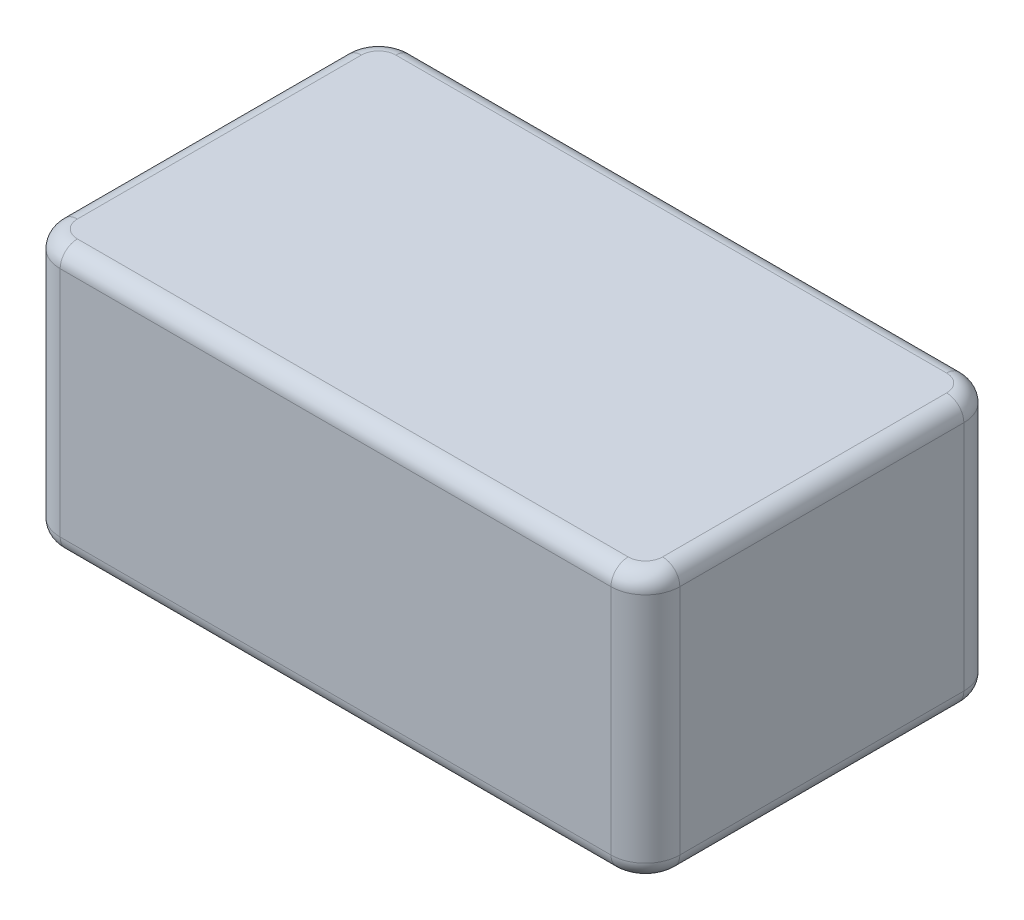
ISO-10303-21;
HEADER;
FILE_DESCRIPTION(('STEP AP214'),'2;1');
FILE_NAME('part.step','',(''),(''),'','','');
FILE_SCHEMA(('AUTOMOTIVE_DESIGN { 1 0 10303 214 1 1 1 1 }'));
ENDSEC;
DATA;
#1=APPLICATION_CONTEXT('core data for automotive mechanical design processes');
#2=APPLICATION_PROTOCOL_DEFINITION('international standard','automotive_design',2000,#1);
#3=PRODUCT_CONTEXT('',#1,'mechanical');
#4=PRODUCT('Part','Part','',(#3));
#5=PRODUCT_RELATED_PRODUCT_CATEGORY('part','',(#4));
#6=PRODUCT_DEFINITION_FORMATION('','',#4);
#7=PRODUCT_DEFINITION_CONTEXT('part definition',#1,'design');
#8=PRODUCT_DEFINITION('design','',#6,#7);
#9=PRODUCT_DEFINITION_SHAPE('','',#8);
#10=(LENGTH_UNIT() NAMED_UNIT(*) SI_UNIT(.MILLI.,.METRE.));
#11=(NAMED_UNIT(*) PLANE_ANGLE_UNIT() SI_UNIT($,.RADIAN.));
#12=(NAMED_UNIT(*) SI_UNIT($,.STERADIAN.) SOLID_ANGLE_UNIT());
#13=UNCERTAINTY_MEASURE_WITH_UNIT(LENGTH_MEASURE(1.E-05),#10,'distance_accuracy_value','');
#14=(GEOMETRIC_REPRESENTATION_CONTEXT(3) GLOBAL_UNCERTAINTY_ASSIGNED_CONTEXT((#13)) GLOBAL_UNIT_ASSIGNED_CONTEXT((#10,
#11,#12)) REPRESENTATION_CONTEXT('',''));
#15=CARTESIAN_POINT('',(0.,0.,0.));
#16=DIRECTION('',(0.,0.,1.));
#17=DIRECTION('',(1.,0.,0.));
#18=AXIS2_PLACEMENT_3D('',#15,#16,#17);
#19=CARTESIAN_POINT('',(0.,15.5,0.));
#20=DIRECTION('',(1.,0.,0.));
#21=DIRECTION('',(0.,0.,-1.));
#22=AXIS2_PLACEMENT_3D('',#19,#20,#21);
#23=PLANE('',#22);
#24=DIRECTION('',(0.,-1.,0.));
#25=VECTOR('',#24,1.);
#26=CARTESIAN_POINT('',(0.,15.5,-18.5));
#27=LINE('',#26,#25);
#28=CARTESIAN_POINT('',(0.,14.5,-18.5));
#29=VERTEX_POINT('',#28);
#30=CARTESIAN_POINT('',(0.,1.,-18.5));
#31=VERTEX_POINT('',#30);
#32=EDGE_CURVE('E306',#29,#31,#27,.T.);
#33=ORIENTED_EDGE('',*,*,#32,.T.);
#34=DIRECTION('',(0.,0.,1.));
#35=VECTOR('',#34,1.);
#36=CARTESIAN_POINT('',(0.,1.,-2.));
#37=LINE('',#36,#35);
#38=CARTESIAN_POINT('',(0.,1.,-2.));
#39=VERTEX_POINT('',#38);
#40=EDGE_CURVE('E200',#31,#39,#37,.T.);
#41=ORIENTED_EDGE('',*,*,#40,.T.);
#42=DIRECTION('',(0.,-1.,0.));
#43=VECTOR('',#42,1.);
#44=CARTESIAN_POINT('',(0.,15.5,-2.));
#45=LINE('',#44,#43);
#46=CARTESIAN_POINT('',(0.,14.5,-2.));
#47=VERTEX_POINT('',#46);
#48=EDGE_CURVE('E251',#39,#47,#45,.F.);
#49=ORIENTED_EDGE('',*,*,#48,.T.);
#50=DIRECTION('',(0.,0.,1.));
#51=VECTOR('',#50,1.);
#52=CARTESIAN_POINT('',(0.,14.5,0.));
#53=LINE('',#52,#51);
#54=EDGE_CURVE('E198',#47,#29,#53,.F.);
#55=ORIENTED_EDGE('',*,*,#54,.T.);
#56=EDGE_LOOP('',(#33,#41,#49,#55));
#57=FACE_BOUND('',#56,.T.);
#58=ADVANCED_FACE('F35',(#57),#23,.F.);
#59=CARTESIAN_POINT('',(0.,15.5,0.));
#60=DIRECTION('',(0.,0.,-1.));
#61=DIRECTION('',(-1.,0.,0.));
#62=AXIS2_PLACEMENT_3D('',#59,#60,#61);
#63=PLANE('',#62);
#64=DIRECTION('',(0.,-1.,0.));
#65=VECTOR('',#64,1.);
#66=CARTESIAN_POINT('',(2.,15.5,0.));
#67=LINE('',#66,#65);
#68=CARTESIAN_POINT('',(2.,14.5,0.));
#69=VERTEX_POINT('',#68);
#70=CARTESIAN_POINT('',(2.,1.,0.));
#71=VERTEX_POINT('',#70);
#72=EDGE_CURVE('E177',#69,#71,#67,.T.);
#73=ORIENTED_EDGE('',*,*,#72,.T.);
#74=DIRECTION('',(1.,0.,0.));
#75=VECTOR('',#74,1.);
#76=CARTESIAN_POINT('',(34.,1.,0.));
#77=LINE('',#76,#75);
#78=CARTESIAN_POINT('',(34.,1.,0.));
#79=VERTEX_POINT('',#78);
#80=EDGE_CURVE('E11',#71,#79,#77,.T.);
#81=ORIENTED_EDGE('',*,*,#80,.T.);
#82=DIRECTION('',(0.,-1.,0.));
#83=VECTOR('',#82,1.);
#84=CARTESIAN_POINT('',(34.,15.5,0.));
#85=LINE('',#84,#83);
#86=CARTESIAN_POINT('',(34.,14.5,0.));
#87=VERTEX_POINT('',#86);
#88=EDGE_CURVE('E174',#79,#87,#85,.F.);
#89=ORIENTED_EDGE('',*,*,#88,.T.);
#90=DIRECTION('',(1.,0.,0.));
#91=VECTOR('',#90,1.);
#92=CARTESIAN_POINT('',(0.,14.5,0.));
#93=LINE('',#92,#91);
#94=EDGE_CURVE('E44',#87,#69,#93,.F.);
#95=ORIENTED_EDGE('',*,*,#94,.T.);
#96=EDGE_LOOP('',(#73,#81,#89,#95));
#97=FACE_BOUND('',#96,.T.);
#98=ADVANCED_FACE('F352',(#97),#63,.F.);
#99=CARTESIAN_POINT('',(36.,15.5,0.));
#100=DIRECTION('',(-1.,0.,0.));
#101=DIRECTION('',(0.,0.,1.));
#102=AXIS2_PLACEMENT_3D('',#99,#100,#101);
#103=PLANE('',#102);
#104=DIRECTION('',(0.,-1.,0.));
#105=VECTOR('',#104,1.);
#106=CARTESIAN_POINT('',(36.,15.5,-2.));
#107=LINE('',#106,#105);
#108=CARTESIAN_POINT('',(36.,14.5,-2.));
#109=VERTEX_POINT('',#108);
#110=CARTESIAN_POINT('',(36.,1.,-2.));
#111=VERTEX_POINT('',#110);
#112=EDGE_CURVE('E297',#109,#111,#107,.T.);
#113=ORIENTED_EDGE('',*,*,#112,.T.);
#114=DIRECTION('',(0.,0.,-1.));
#115=VECTOR('',#114,1.);
#116=CARTESIAN_POINT('',(36.,1.,-18.5));
#117=LINE('',#116,#115);
#118=CARTESIAN_POINT('',(36.,1.,-18.5));
#119=VERTEX_POINT('',#118);
#120=EDGE_CURVE('E216',#111,#119,#117,.T.);
#121=ORIENTED_EDGE('',*,*,#120,.T.);
#122=DIRECTION('',(0.,-1.,0.));
#123=VECTOR('',#122,1.);
#124=CARTESIAN_POINT('',(36.,15.5,-18.5));
#125=LINE('',#124,#123);
#126=CARTESIAN_POINT('',(36.,14.5,-18.5));
#127=VERTEX_POINT('',#126);
#128=EDGE_CURVE('E288',#119,#127,#125,.F.);
#129=ORIENTED_EDGE('',*,*,#128,.T.);
#130=DIRECTION('',(0.,0.,-1.));
#131=VECTOR('',#130,1.);
#132=CARTESIAN_POINT('',(36.,14.5,0.));
#133=LINE('',#132,#131);
#134=EDGE_CURVE('E214',#127,#109,#133,.F.);
#135=ORIENTED_EDGE('',*,*,#134,.T.);
#136=EDGE_LOOP('',(#113,#121,#129,#135));
#137=FACE_BOUND('',#136,.T.);
#138=ADVANCED_FACE('F294',(#137),#103,.F.);
#139=CARTESIAN_POINT('',(0.,15.5,-20.5));
#140=DIRECTION('',(0.,0.,1.));
#141=DIRECTION('',(1.,0.,0.));
#142=AXIS2_PLACEMENT_3D('',#139,#140,#141);
#143=PLANE('',#142);
#144=DIRECTION('',(0.,-1.,0.));
#145=VECTOR('',#144,1.);
#146=CARTESIAN_POINT('',(34.,15.5,-20.5));
#147=LINE('',#146,#145);
#148=CARTESIAN_POINT('',(34.,14.5,-20.5));
#149=VERTEX_POINT('',#148);
#150=CARTESIAN_POINT('',(34.,1.,-20.5));
#151=VERTEX_POINT('',#150);
#152=EDGE_CURVE('E291',#149,#151,#147,.T.);
#153=ORIENTED_EDGE('',*,*,#152,.T.);
#154=DIRECTION('',(-1.,0.,0.));
#155=VECTOR('',#154,1.);
#156=CARTESIAN_POINT('',(2.,1.,-20.5));
#157=LINE('',#156,#155);
#158=CARTESIAN_POINT('',(2.,1.,-20.5));
#159=VERTEX_POINT('',#158);
#160=EDGE_CURVE('E208',#151,#159,#157,.T.);
#161=ORIENTED_EDGE('',*,*,#160,.T.);
#162=DIRECTION('',(0.,-1.,0.));
#163=VECTOR('',#162,1.);
#164=CARTESIAN_POINT('',(2.,15.5,-20.5));
#165=LINE('',#164,#163);
#166=CARTESIAN_POINT('',(2.,14.5,-20.5));
#167=VERTEX_POINT('',#166);
#168=EDGE_CURVE('E300',#159,#167,#165,.F.);
#169=ORIENTED_EDGE('',*,*,#168,.T.);
#170=DIRECTION('',(-1.,0.,0.));
#171=VECTOR('',#170,1.);
#172=CARTESIAN_POINT('',(0.,14.5,-20.5));
#173=LINE('',#172,#171);
#174=EDGE_CURVE('E206',#167,#149,#173,.F.);
#175=ORIENTED_EDGE('',*,*,#174,.T.);
#176=EDGE_LOOP('',(#153,#161,#169,#175));
#177=FACE_BOUND('',#176,.T.);
#178=ADVANCED_FACE('F550',(#177),#143,.F.);
#179=CARTESIAN_POINT('',(0.,15.5,0.));
#180=DIRECTION('',(0.,-1.,0.));
#181=DIRECTION('',(0.,0.,-1.));
#182=AXIS2_PLACEMENT_3D('',#179,#180,#181);
#183=PLANE('',#182);
#184=DIRECTION('',(0.,0.,1.));
#185=VECTOR('',#184,1.);
#186=CARTESIAN_POINT('',(1.,15.5,0.));
#187=LINE('',#186,#185);
#188=CARTESIAN_POINT('',(1.,15.5,-18.5));
#189=VERTEX_POINT('',#188);
#190=CARTESIAN_POINT('',(1.,15.5,-2.));
#191=VERTEX_POINT('',#190);
#192=EDGE_CURVE('E52',#189,#191,#187,.T.);
#193=ORIENTED_EDGE('',*,*,#192,.T.);
#194=CARTESIAN_POINT('',(2.,15.5,-2.));
#195=DIRECTION('',(0.,-1.,0.));
#196=DIRECTION('',(0.,0.,-1.));
#197=AXIS2_PLACEMENT_3D('',#194,#195,#196);
#198=CIRCLE('',#197,1.);
#199=CARTESIAN_POINT('',(2.,15.5,-1.));
#200=VERTEX_POINT('',#199);
#201=EDGE_CURVE('E233',#191,#200,#198,.F.);
#202=ORIENTED_EDGE('',*,*,#201,.T.);
#203=DIRECTION('',(1.,0.,0.));
#204=VECTOR('',#203,1.);
#205=CARTESIAN_POINT('',(0.,15.5,-1.));
#206=LINE('',#205,#204);
#207=CARTESIAN_POINT('',(34.,15.5,-1.));
#208=VERTEX_POINT('',#207);
#209=EDGE_CURVE('E221',#200,#208,#206,.T.);
#210=ORIENTED_EDGE('',*,*,#209,.T.);
#211=CARTESIAN_POINT('',(34.,15.5,-2.));
#212=DIRECTION('',(0.,-1.,0.));
#213=DIRECTION('',(0.,0.,-1.));
#214=AXIS2_PLACEMENT_3D('',#211,#212,#213);
#215=CIRCLE('',#214,1.);
#216=CARTESIAN_POINT('',(35.,15.5,-2.));
#217=VERTEX_POINT('',#216);
#218=EDGE_CURVE('E223',#208,#217,#215,.F.);
#219=ORIENTED_EDGE('',*,*,#218,.T.);
#220=DIRECTION('',(0.,0.,-1.));
#221=VECTOR('',#220,1.);
#222=CARTESIAN_POINT('',(35.,15.5,0.));
#223=LINE('',#222,#221);
#224=CARTESIAN_POINT('',(35.,15.5,-18.5));
#225=VERTEX_POINT('',#224);
#226=EDGE_CURVE('E225',#217,#225,#223,.T.);
#227=ORIENTED_EDGE('',*,*,#226,.T.);
#228=CARTESIAN_POINT('',(34.,15.5,-18.5));
#229=DIRECTION('',(0.,-1.,0.));
#230=DIRECTION('',(0.,0.,-1.));
#231=AXIS2_PLACEMENT_3D('',#228,#229,#230);
#232=CIRCLE('',#231,1.);
#233=CARTESIAN_POINT('',(34.,15.5,-19.5));
#234=VERTEX_POINT('',#233);
#235=EDGE_CURVE('E227',#225,#234,#232,.F.);
#236=ORIENTED_EDGE('',*,*,#235,.T.);
#237=DIRECTION('',(-1.,0.,0.));
#238=VECTOR('',#237,1.);
#239=CARTESIAN_POINT('',(0.,15.5,-19.5));
#240=LINE('',#239,#238);
#241=CARTESIAN_POINT('',(2.,15.5,-19.5));
#242=VERTEX_POINT('',#241);
#243=EDGE_CURVE('E229',#234,#242,#240,.T.);
#244=ORIENTED_EDGE('',*,*,#243,.T.);
#245=CARTESIAN_POINT('',(2.,15.5,-18.5));
#246=DIRECTION('',(0.,-1.,0.));
#247=DIRECTION('',(0.,0.,-1.));
#248=AXIS2_PLACEMENT_3D('',#245,#246,#247);
#249=CIRCLE('',#248,1.);
#250=EDGE_CURVE('E57',#242,#189,#249,.F.);
#251=ORIENTED_EDGE('',*,*,#250,.T.);
#252=EDGE_LOOP('',(#193,#202,#210,#219,#227,#236,#244,#251));
#253=FACE_BOUND('',#252,.T.);
#254=ADVANCED_FACE('F542',(#253),#183,.F.);
#255=CARTESIAN_POINT('',(0.,0.,0.));
#256=DIRECTION('',(0.,-1.,0.));
#257=DIRECTION('',(0.,0.,-1.));
#258=AXIS2_PLACEMENT_3D('',#255,#256,#257);
#259=PLANE('',#258);
#260=DIRECTION('',(1.,0.,0.));
#261=VECTOR('',#260,1.);
#262=CARTESIAN_POINT('',(2.,0.,-1.));
#263=LINE('',#262,#261);
#264=CARTESIAN_POINT('',(34.,0.,-1.));
#265=VERTEX_POINT('',#264);
#266=CARTESIAN_POINT('',(2.,0.,-1.));
#267=VERTEX_POINT('',#266);
#268=EDGE_CURVE('E153',#265,#267,#263,.F.);
#269=ORIENTED_EDGE('',*,*,#268,.T.);
#270=CARTESIAN_POINT('',(2.,0.,-2.));
#271=DIRECTION('',(0.,-1.,0.));
#272=DIRECTION('',(0.,0.,-1.));
#273=AXIS2_PLACEMENT_3D('',#270,#271,#272);
#274=CIRCLE('',#273,1.);
#275=CARTESIAN_POINT('',(1.,0.,-2.));
#276=VERTEX_POINT('',#275);
#277=EDGE_CURVE('E190',#267,#276,#274,.T.);
#278=ORIENTED_EDGE('',*,*,#277,.T.);
#279=DIRECTION('',(0.,0.,1.));
#280=VECTOR('',#279,1.);
#281=CARTESIAN_POINT('',(1.,0.,-18.5));
#282=LINE('',#281,#280);
#283=CARTESIAN_POINT('',(1.,0.,-18.5));
#284=VERTEX_POINT('',#283);
#285=EDGE_CURVE('E188',#276,#284,#282,.F.);
#286=ORIENTED_EDGE('',*,*,#285,.T.);
#287=CARTESIAN_POINT('',(2.,0.,-18.5));
#288=DIRECTION('',(0.,-1.,0.));
#289=DIRECTION('',(0.,0.,-1.));
#290=AXIS2_PLACEMENT_3D('',#287,#288,#289);
#291=CIRCLE('',#290,1.);
#292=CARTESIAN_POINT('',(2.,0.,-19.5));
#293=VERTEX_POINT('',#292);
#294=EDGE_CURVE('E186',#284,#293,#291,.T.);
#295=ORIENTED_EDGE('',*,*,#294,.T.);
#296=DIRECTION('',(-1.,0.,0.));
#297=VECTOR('',#296,1.);
#298=CARTESIAN_POINT('',(34.,0.,-19.5));
#299=LINE('',#298,#297);
#300=CARTESIAN_POINT('',(34.,0.,-19.5));
#301=VERTEX_POINT('',#300);
#302=EDGE_CURVE('E184',#293,#301,#299,.F.);
#303=ORIENTED_EDGE('',*,*,#302,.T.);
#304=CARTESIAN_POINT('',(34.,0.,-18.5));
#305=DIRECTION('',(0.,-1.,0.));
#306=DIRECTION('',(0.,0.,-1.));
#307=AXIS2_PLACEMENT_3D('',#304,#305,#306);
#308=CIRCLE('',#307,1.);
#309=CARTESIAN_POINT('',(35.,0.,-18.5));
#310=VERTEX_POINT('',#309);
#311=EDGE_CURVE('E182',#301,#310,#308,.T.);
#312=ORIENTED_EDGE('',*,*,#311,.T.);
#313=DIRECTION('',(0.,0.,-1.));
#314=VECTOR('',#313,1.);
#315=CARTESIAN_POINT('',(35.,0.,-2.));
#316=LINE('',#315,#314);
#317=CARTESIAN_POINT('',(35.,0.,-2.));
#318=VERTEX_POINT('',#317);
#319=EDGE_CURVE('E156',#310,#318,#316,.F.);
#320=ORIENTED_EDGE('',*,*,#319,.T.);
#321=CARTESIAN_POINT('',(34.,0.,-2.));
#322=DIRECTION('',(0.,-1.,0.));
#323=DIRECTION('',(0.,0.,-1.));
#324=AXIS2_PLACEMENT_3D('',#321,#322,#323);
#325=CIRCLE('',#324,1.);
#326=EDGE_CURVE('E148',#318,#265,#325,.T.);
#327=ORIENTED_EDGE('',*,*,#326,.T.);
#328=EDGE_LOOP('',(#269,#278,#286,#295,#303,#312,#320,#327));
#329=FACE_BOUND('',#328,.T.);
#330=ADVANCED_FACE('F150',(#329),#259,.T.);
#331=CARTESIAN_POINT('',(2.,15.5,-18.5));
#332=DIRECTION('',(0.,-1.,0.));
#333=DIRECTION('',(0.,0.,-1.));
#334=AXIS2_PLACEMENT_3D('',#331,#332,#333);
#335=CYLINDRICAL_SURFACE('',#334,2.);
#336=ORIENTED_EDGE('',*,*,#168,.F.);
#337=CARTESIAN_POINT('',(2.,1.,-18.5));
#338=DIRECTION('',(0.,-1.,0.));
#339=DIRECTION('',(0.,0.,-1.));
#340=AXIS2_PLACEMENT_3D('',#337,#338,#339);
#341=CIRCLE('',#340,2.);
#342=EDGE_CURVE('E204',#159,#31,#341,.F.);
#343=ORIENTED_EDGE('',*,*,#342,.T.);
#344=ORIENTED_EDGE('',*,*,#32,.F.);
#345=CARTESIAN_POINT('',(2.,14.5,-18.5));
#346=DIRECTION('',(0.,-1.,0.));
#347=DIRECTION('',(0.,0.,-1.));
#348=AXIS2_PLACEMENT_3D('',#345,#346,#347);
#349=CIRCLE('',#348,2.);
#350=EDGE_CURVE('E202',#29,#167,#349,.T.);
#351=ORIENTED_EDGE('',*,*,#350,.T.);
#352=EDGE_LOOP('',(#336,#343,#344,#351));
#353=FACE_BOUND('',#352,.T.);
#354=ADVANCED_FACE('F361',(#353),#335,.T.);
#355=CARTESIAN_POINT('',(34.,15.5,-18.5));
#356=DIRECTION('',(0.,-1.,0.));
#357=DIRECTION('',(0.,0.,-1.));
#358=AXIS2_PLACEMENT_3D('',#355,#356,#357);
#359=CYLINDRICAL_SURFACE('',#358,2.);
#360=ORIENTED_EDGE('',*,*,#128,.F.);
#361=CARTESIAN_POINT('',(34.,1.,-18.5));
#362=DIRECTION('',(0.,-1.,0.));
#363=DIRECTION('',(0.,0.,-1.));
#364=AXIS2_PLACEMENT_3D('',#361,#362,#363);
#365=CIRCLE('',#364,2.);
#366=EDGE_CURVE('E212',#119,#151,#365,.F.);
#367=ORIENTED_EDGE('',*,*,#366,.T.);
#368=ORIENTED_EDGE('',*,*,#152,.F.);
#369=CARTESIAN_POINT('',(34.,14.5,-18.5));
#370=DIRECTION('',(0.,-1.,0.));
#371=DIRECTION('',(0.,0.,-1.));
#372=AXIS2_PLACEMENT_3D('',#369,#370,#371);
#373=CIRCLE('',#372,2.);
#374=EDGE_CURVE('E210',#149,#127,#373,.T.);
#375=ORIENTED_EDGE('',*,*,#374,.T.);
#376=EDGE_LOOP('',(#360,#367,#368,#375));
#377=FACE_BOUND('',#376,.T.);
#378=ADVANCED_FACE('F287',(#377),#359,.T.);
#379=CARTESIAN_POINT('',(34.,15.5,-2.));
#380=DIRECTION('',(0.,-1.,0.));
#381=DIRECTION('',(0.,0.,-1.));
#382=AXIS2_PLACEMENT_3D('',#379,#380,#381);
#383=CYLINDRICAL_SURFACE('',#382,2.);
#384=ORIENTED_EDGE('',*,*,#88,.F.);
#385=CARTESIAN_POINT('',(34.,1.,-2.));
#386=DIRECTION('',(0.,-1.,0.));
#387=DIRECTION('',(0.,0.,-1.));
#388=AXIS2_PLACEMENT_3D('',#385,#386,#387);
#389=CIRCLE('',#388,2.);
#390=EDGE_CURVE('E165',#79,#111,#389,.F.);
#391=ORIENTED_EDGE('',*,*,#390,.T.);
#392=ORIENTED_EDGE('',*,*,#112,.F.);
#393=CARTESIAN_POINT('',(34.,14.5,-2.));
#394=DIRECTION('',(0.,-1.,0.));
#395=DIRECTION('',(0.,0.,-1.));
#396=AXIS2_PLACEMENT_3D('',#393,#394,#395);
#397=CIRCLE('',#396,2.);
#398=EDGE_CURVE('E218',#109,#87,#397,.T.);
#399=ORIENTED_EDGE('',*,*,#398,.T.);
#400=EDGE_LOOP('',(#384,#391,#392,#399));
#401=FACE_BOUND('',#400,.T.);
#402=ADVANCED_FACE('F367',(#401),#383,.T.);
#403=CARTESIAN_POINT('',(2.,15.5,-2.));
#404=DIRECTION('',(0.,-1.,0.));
#405=DIRECTION('',(0.,0.,-1.));
#406=AXIS2_PLACEMENT_3D('',#403,#404,#405);
#407=CYLINDRICAL_SURFACE('',#406,2.);
#408=ORIENTED_EDGE('',*,*,#48,.F.);
#409=CARTESIAN_POINT('',(2.,1.,-2.));
#410=DIRECTION('',(0.,-1.,0.));
#411=DIRECTION('',(0.,0.,-1.));
#412=AXIS2_PLACEMENT_3D('',#409,#410,#411);
#413=CIRCLE('',#412,2.);
#414=EDGE_CURVE('E195',#39,#71,#413,.F.);
#415=ORIENTED_EDGE('',*,*,#414,.T.);
#416=ORIENTED_EDGE('',*,*,#72,.F.);
#417=CARTESIAN_POINT('',(2.,14.5,-2.));
#418=DIRECTION('',(0.,-1.,0.));
#419=DIRECTION('',(0.,0.,-1.));
#420=AXIS2_PLACEMENT_3D('',#417,#418,#419);
#421=CIRCLE('',#420,2.);
#422=EDGE_CURVE('E192',#69,#47,#421,.T.);
#423=ORIENTED_EDGE('',*,*,#422,.T.);
#424=EDGE_LOOP('',(#408,#415,#416,#423));
#425=FACE_BOUND('',#424,.T.);
#426=ADVANCED_FACE('F317',(#425),#407,.T.);
#427=CARTESIAN_POINT('',(34.,1.,-18.5));
#428=DIRECTION('',(0.,-1.,0.));
#429=DIRECTION('',(0.,0.,-1.));
#430=AXIS2_PLACEMENT_3D('',#427,#428,#429);
#431=DEGENERATE_TOROIDAL_SURFACE('',#430,1.,1.,.T.);
#432=CARTESIAN_POINT('',(34.,1.,-19.5));
#433=DIRECTION('',(-1.,0.,0.));
#434=DIRECTION('',(0.,0.,1.));
#435=AXIS2_PLACEMENT_3D('',#432,#433,#434);
#436=CIRCLE('',#435,1.);
#437=EDGE_CURVE('E245',#151,#301,#436,.T.);
#438=ORIENTED_EDGE('',*,*,#437,.F.);
#439=ORIENTED_EDGE('',*,*,#366,.F.);
#440=CARTESIAN_POINT('',(35.,1.,-18.5));
#441=DIRECTION('',(0.,0.,1.));
#442=DIRECTION('',(1.,0.,0.));
#443=AXIS2_PLACEMENT_3D('',#440,#441,#442);
#444=CIRCLE('',#443,1.);
#445=EDGE_CURVE('E248',#310,#119,#444,.T.);
#446=ORIENTED_EDGE('',*,*,#445,.F.);
#447=ORIENTED_EDGE('',*,*,#311,.F.);
#448=EDGE_LOOP('',(#438,#439,#446,#447));
#449=FACE_BOUND('',#448,.T.);
#450=ADVANCED_FACE('F340',(#449),#431,.T.);
#451=CARTESIAN_POINT('',(35.,1.,0.));
#452=DIRECTION('',(0.,0.,1.));
#453=DIRECTION('',(1.,0.,0.));
#454=AXIS2_PLACEMENT_3D('',#451,#452,#453);
#455=CYLINDRICAL_SURFACE('',#454,1.);
#456=ORIENTED_EDGE('',*,*,#445,.T.);
#457=ORIENTED_EDGE('',*,*,#120,.F.);
#458=CARTESIAN_POINT('',(35.,1.,-2.));
#459=DIRECTION('',(0.,0.,1.));
#460=DIRECTION('',(1.,0.,0.));
#461=AXIS2_PLACEMENT_3D('',#458,#459,#460);
#462=CIRCLE('',#461,1.);
#463=EDGE_CURVE('E243',#318,#111,#462,.T.);
#464=ORIENTED_EDGE('',*,*,#463,.F.);
#465=ORIENTED_EDGE('',*,*,#319,.F.);
#466=EDGE_LOOP('',(#456,#457,#464,#465));
#467=FACE_BOUND('',#466,.T.);
#468=ADVANCED_FACE('F342',(#467),#455,.T.);
#469=CARTESIAN_POINT('',(0.,1.,-19.5));
#470=DIRECTION('',(1.,0.,0.));
#471=DIRECTION('',(0.,0.,-1.));
#472=AXIS2_PLACEMENT_3D('',#469,#470,#471);
#473=CYLINDRICAL_SURFACE('',#472,1.);
#474=ORIENTED_EDGE('',*,*,#437,.T.);
#475=ORIENTED_EDGE('',*,*,#302,.F.);
#476=CARTESIAN_POINT('',(2.,1.,-19.5));
#477=DIRECTION('',(-1.,0.,0.));
#478=DIRECTION('',(0.,0.,1.));
#479=AXIS2_PLACEMENT_3D('',#476,#477,#478);
#480=CIRCLE('',#479,1.);
#481=EDGE_CURVE('E168',#159,#293,#480,.T.);
#482=ORIENTED_EDGE('',*,*,#481,.F.);
#483=ORIENTED_EDGE('',*,*,#160,.F.);
#484=EDGE_LOOP('',(#474,#475,#482,#483));
#485=FACE_BOUND('',#484,.T.);
#486=ADVANCED_FACE('F335',(#485),#473,.T.);
#487=CARTESIAN_POINT('',(34.,1.,-2.));
#488=DIRECTION('',(0.,-1.,0.));
#489=DIRECTION('',(0.,0.,-1.));
#490=AXIS2_PLACEMENT_3D('',#487,#488,#489);
#491=DEGENERATE_TOROIDAL_SURFACE('',#490,1.,1.,.T.);
#492=ORIENTED_EDGE('',*,*,#463,.T.);
#493=ORIENTED_EDGE('',*,*,#390,.F.);
#494=CARTESIAN_POINT('',(34.,1.,-1.));
#495=DIRECTION('',(-1.,0.,0.));
#496=DIRECTION('',(0.,0.,1.));
#497=AXIS2_PLACEMENT_3D('',#494,#495,#496);
#498=CIRCLE('',#497,1.);
#499=EDGE_CURVE('E163',#265,#79,#498,.T.);
#500=ORIENTED_EDGE('',*,*,#499,.F.);
#501=ORIENTED_EDGE('',*,*,#326,.F.);
#502=EDGE_LOOP('',(#492,#493,#500,#501));
#503=FACE_BOUND('',#502,.T.);
#504=ADVANCED_FACE('F164',(#503),#491,.T.);
#505=CARTESIAN_POINT('',(2.,1.,-18.5));
#506=DIRECTION('',(0.,-1.,0.));
#507=DIRECTION('',(0.,0.,-1.));
#508=AXIS2_PLACEMENT_3D('',#505,#506,#507);
#509=DEGENERATE_TOROIDAL_SURFACE('',#508,1.,1.,.T.);
#510=ORIENTED_EDGE('',*,*,#481,.T.);
#511=ORIENTED_EDGE('',*,*,#294,.F.);
#512=CARTESIAN_POINT('',(1.,1.,-18.5));
#513=DIRECTION('',(0.,0.,1.));
#514=DIRECTION('',(1.,0.,0.));
#515=AXIS2_PLACEMENT_3D('',#512,#513,#514);
#516=CIRCLE('',#515,1.);
#517=EDGE_CURVE('E169',#31,#284,#516,.T.);
#518=ORIENTED_EDGE('',*,*,#517,.F.);
#519=ORIENTED_EDGE('',*,*,#342,.F.);
#520=EDGE_LOOP('',(#510,#511,#518,#519));
#521=FACE_BOUND('',#520,.T.);
#522=ADVANCED_FACE('F330',(#521),#509,.T.);
#523=CARTESIAN_POINT('',(0.,1.,-1.));
#524=DIRECTION('',(-1.,0.,0.));
#525=DIRECTION('',(0.,0.,1.));
#526=AXIS2_PLACEMENT_3D('',#523,#524,#525);
#527=CYLINDRICAL_SURFACE('',#526,1.);
#528=ORIENTED_EDGE('',*,*,#499,.T.);
#529=ORIENTED_EDGE('',*,*,#80,.F.);
#530=CARTESIAN_POINT('',(2.,1.,-1.));
#531=DIRECTION('',(-1.,0.,0.));
#532=DIRECTION('',(0.,0.,1.));
#533=AXIS2_PLACEMENT_3D('',#530,#531,#532);
#534=CIRCLE('',#533,1.);
#535=EDGE_CURVE('E172',#267,#71,#534,.T.);
#536=ORIENTED_EDGE('',*,*,#535,.F.);
#537=ORIENTED_EDGE('',*,*,#268,.F.);
#538=EDGE_LOOP('',(#528,#529,#536,#537));
#539=FACE_BOUND('',#538,.T.);
#540=ADVANCED_FACE('F171',(#539),#527,.T.);
#541=CARTESIAN_POINT('',(1.,1.,0.));
#542=DIRECTION('',(0.,0.,-1.));
#543=DIRECTION('',(-1.,0.,0.));
#544=AXIS2_PLACEMENT_3D('',#541,#542,#543);
#545=CYLINDRICAL_SURFACE('',#544,1.);
#546=ORIENTED_EDGE('',*,*,#517,.T.);
#547=ORIENTED_EDGE('',*,*,#285,.F.);
#548=CARTESIAN_POINT('',(1.,1.,-2.));
#549=DIRECTION('',(0.,0.,1.));
#550=DIRECTION('',(1.,0.,0.));
#551=AXIS2_PLACEMENT_3D('',#548,#549,#550);
#552=CIRCLE('',#551,1.);
#553=EDGE_CURVE('E236',#39,#276,#552,.T.);
#554=ORIENTED_EDGE('',*,*,#553,.F.);
#555=ORIENTED_EDGE('',*,*,#40,.F.);
#556=EDGE_LOOP('',(#546,#547,#554,#555));
#557=FACE_BOUND('',#556,.T.);
#558=ADVANCED_FACE('F325',(#557),#545,.T.);
#559=CARTESIAN_POINT('',(2.,1.,-2.));
#560=DIRECTION('',(0.,-1.,0.));
#561=DIRECTION('',(0.,0.,-1.));
#562=AXIS2_PLACEMENT_3D('',#559,#560,#561);
#563=DEGENERATE_TOROIDAL_SURFACE('',#562,1.,1.,.T.);
#564=ORIENTED_EDGE('',*,*,#535,.T.);
#565=ORIENTED_EDGE('',*,*,#414,.F.);
#566=ORIENTED_EDGE('',*,*,#553,.T.);
#567=ORIENTED_EDGE('',*,*,#277,.F.);
#568=EDGE_LOOP('',(#564,#565,#566,#567));
#569=FACE_BOUND('',#568,.T.);
#570=ADVANCED_FACE('F322',(#569),#563,.T.);
#571=CARTESIAN_POINT('',(34.,14.5,-18.5));
#572=DIRECTION('',(0.,-1.,0.));
#573=DIRECTION('',(0.,0.,-1.));
#574=AXIS2_PLACEMENT_3D('',#571,#572,#573);
#575=DEGENERATE_TOROIDAL_SURFACE('',#574,1.,1.,.T.);
#576=CARTESIAN_POINT('',(35.,14.5,-18.5));
#577=DIRECTION('',(0.,0.,1.));
#578=DIRECTION('',(1.,0.,0.));
#579=AXIS2_PLACEMENT_3D('',#576,#577,#578);
#580=CIRCLE('',#579,1.);
#581=EDGE_CURVE('E267',#127,#225,#580,.T.);
#582=ORIENTED_EDGE('',*,*,#581,.F.);
#583=ORIENTED_EDGE('',*,*,#374,.F.);
#584=CARTESIAN_POINT('',(34.,14.5,-19.5));
#585=DIRECTION('',(-1.,0.,0.));
#586=DIRECTION('',(0.,0.,1.));
#587=AXIS2_PLACEMENT_3D('',#584,#585,#586);
#588=CIRCLE('',#587,1.);
#589=EDGE_CURVE('E39',#234,#149,#588,.T.);
#590=ORIENTED_EDGE('',*,*,#589,.F.);
#591=ORIENTED_EDGE('',*,*,#235,.F.);
#592=EDGE_LOOP('',(#582,#583,#590,#591));
#593=FACE_BOUND('',#592,.T.);
#594=ADVANCED_FACE('F37',(#593),#575,.T.);
#595=CARTESIAN_POINT('',(0.,14.5,-19.5));
#596=DIRECTION('',(-1.,0.,0.));
#597=DIRECTION('',(0.,0.,1.));
#598=AXIS2_PLACEMENT_3D('',#595,#596,#597);
#599=CYLINDRICAL_SURFACE('',#598,1.);
#600=ORIENTED_EDGE('',*,*,#589,.T.);
#601=ORIENTED_EDGE('',*,*,#174,.F.);
#602=CARTESIAN_POINT('',(2.,14.5,-19.5));
#603=DIRECTION('',(-1.,0.,0.));
#604=DIRECTION('',(0.,0.,1.));
#605=AXIS2_PLACEMENT_3D('',#602,#603,#604);
#606=CIRCLE('',#605,1.);
#607=EDGE_CURVE('E265',#242,#167,#606,.T.);
#608=ORIENTED_EDGE('',*,*,#607,.F.);
#609=ORIENTED_EDGE('',*,*,#243,.F.);
#610=EDGE_LOOP('',(#600,#601,#608,#609));
#611=FACE_BOUND('',#610,.T.);
#612=ADVANCED_FACE('F278',(#611),#599,.T.);
#613=CARTESIAN_POINT('',(35.,14.5,0.));
#614=DIRECTION('',(0.,0.,-1.));
#615=DIRECTION('',(-1.,0.,0.));
#616=AXIS2_PLACEMENT_3D('',#613,#614,#615);
#617=CYLINDRICAL_SURFACE('',#616,1.);
#618=ORIENTED_EDGE('',*,*,#581,.T.);
#619=ORIENTED_EDGE('',*,*,#226,.F.);
#620=CARTESIAN_POINT('',(35.,14.5,-2.));
#621=DIRECTION('',(0.,0.,1.));
#622=DIRECTION('',(1.,0.,0.));
#623=AXIS2_PLACEMENT_3D('',#620,#621,#622);
#624=CIRCLE('',#623,1.);
#625=EDGE_CURVE('E262',#109,#217,#624,.T.);
#626=ORIENTED_EDGE('',*,*,#625,.F.);
#627=ORIENTED_EDGE('',*,*,#134,.F.);
#628=EDGE_LOOP('',(#618,#619,#626,#627));
#629=FACE_BOUND('',#628,.T.);
#630=ADVANCED_FACE('F413',(#629),#617,.T.);
#631=CARTESIAN_POINT('',(2.,14.5,-18.5));
#632=DIRECTION('',(0.,-1.,0.));
#633=DIRECTION('',(0.,0.,-1.));
#634=AXIS2_PLACEMENT_3D('',#631,#632,#633);
#635=DEGENERATE_TOROIDAL_SURFACE('',#634,1.,1.,.T.);
#636=ORIENTED_EDGE('',*,*,#607,.T.);
#637=ORIENTED_EDGE('',*,*,#350,.F.);
#638=CARTESIAN_POINT('',(1.,14.5,-18.5));
#639=DIRECTION('',(0.,0.,1.));
#640=DIRECTION('',(1.,0.,0.));
#641=AXIS2_PLACEMENT_3D('',#638,#639,#640);
#642=CIRCLE('',#641,1.);
#643=EDGE_CURVE('E259',#189,#29,#642,.T.);
#644=ORIENTED_EDGE('',*,*,#643,.F.);
#645=ORIENTED_EDGE('',*,*,#250,.F.);
#646=EDGE_LOOP('',(#636,#637,#644,#645));
#647=FACE_BOUND('',#646,.T.);
#648=ADVANCED_FACE('F419',(#647),#635,.T.);
#649=CARTESIAN_POINT('',(34.,14.5,-2.));
#650=DIRECTION('',(0.,-1.,0.));
#651=DIRECTION('',(0.,0.,-1.));
#652=AXIS2_PLACEMENT_3D('',#649,#650,#651);
#653=DEGENERATE_TOROIDAL_SURFACE('',#652,1.,1.,.T.);
#654=ORIENTED_EDGE('',*,*,#625,.T.);
#655=ORIENTED_EDGE('',*,*,#218,.F.);
#656=CARTESIAN_POINT('',(34.,14.5,-1.));
#657=DIRECTION('',(-1.,0.,0.));
#658=DIRECTION('',(0.,0.,1.));
#659=AXIS2_PLACEMENT_3D('',#656,#657,#658);
#660=CIRCLE('',#659,1.);
#661=EDGE_CURVE('E256',#87,#208,#660,.T.);
#662=ORIENTED_EDGE('',*,*,#661,.F.);
#663=ORIENTED_EDGE('',*,*,#398,.F.);
#664=EDGE_LOOP('',(#654,#655,#662,#663));
#665=FACE_BOUND('',#664,.T.);
#666=ADVANCED_FACE('F426',(#665),#653,.T.);
#667=CARTESIAN_POINT('',(1.,14.5,0.));
#668=DIRECTION('',(0.,0.,1.));
#669=DIRECTION('',(1.,0.,0.));
#670=AXIS2_PLACEMENT_3D('',#667,#668,#669);
#671=CYLINDRICAL_SURFACE('',#670,1.);
#672=ORIENTED_EDGE('',*,*,#643,.T.);
#673=ORIENTED_EDGE('',*,*,#54,.F.);
#674=CARTESIAN_POINT('',(1.,14.5,-2.));
#675=DIRECTION('',(0.,0.,1.));
#676=DIRECTION('',(1.,0.,0.));
#677=AXIS2_PLACEMENT_3D('',#674,#675,#676);
#678=CIRCLE('',#677,1.);
#679=EDGE_CURVE('E254',#191,#47,#678,.T.);
#680=ORIENTED_EDGE('',*,*,#679,.F.);
#681=ORIENTED_EDGE('',*,*,#192,.F.);
#682=EDGE_LOOP('',(#672,#673,#680,#681));
#683=FACE_BOUND('',#682,.T.);
#684=ADVANCED_FACE('F434',(#683),#671,.T.);
#685=CARTESIAN_POINT('',(0.,14.5,-1.));
#686=DIRECTION('',(1.,0.,0.));
#687=DIRECTION('',(0.,0.,-1.));
#688=AXIS2_PLACEMENT_3D('',#685,#686,#687);
#689=CYLINDRICAL_SURFACE('',#688,1.);
#690=ORIENTED_EDGE('',*,*,#661,.T.);
#691=ORIENTED_EDGE('',*,*,#209,.F.);
#692=CARTESIAN_POINT('',(2.,14.5,-1.));
#693=DIRECTION('',(-1.,0.,0.));
#694=DIRECTION('',(0.,0.,1.));
#695=AXIS2_PLACEMENT_3D('',#692,#693,#694);
#696=CIRCLE('',#695,1.);
#697=EDGE_CURVE('E252',#69,#200,#696,.T.);
#698=ORIENTED_EDGE('',*,*,#697,.F.);
#699=ORIENTED_EDGE('',*,*,#94,.F.);
#700=EDGE_LOOP('',(#690,#691,#698,#699));
#701=FACE_BOUND('',#700,.T.);
#702=ADVANCED_FACE('F442',(#701),#689,.T.);
#703=CARTESIAN_POINT('',(2.,14.5,-2.));
#704=DIRECTION('',(0.,-1.,0.));
#705=DIRECTION('',(0.,0.,-1.));
#706=AXIS2_PLACEMENT_3D('',#703,#704,#705);
#707=DEGENERATE_TOROIDAL_SURFACE('',#706,1.,1.,.T.);
#708=ORIENTED_EDGE('',*,*,#679,.T.);
#709=ORIENTED_EDGE('',*,*,#422,.F.);
#710=ORIENTED_EDGE('',*,*,#697,.T.);
#711=ORIENTED_EDGE('',*,*,#201,.F.);
#712=EDGE_LOOP('',(#708,#709,#710,#711));
#713=FACE_BOUND('',#712,.T.);
#714=ADVANCED_FACE('F450',(#713),#707,.T.);
#715=CLOSED_SHELL('',(#58,#98,#138,#178,#254,#330,#354,#378,#402,#426,#450,#468,#486,#504,#522,
#540,#558,#570,#594,#612,#630,#648,#666,#684,#702,#714));
#716=MANIFOLD_SOLID_BREP('B2',#715);
#717=ADVANCED_BREP_SHAPE_REPRESENTATION('',(#18,#716),#14);
#718=SHAPE_DEFINITION_REPRESENTATION(#9,#717);
ENDSEC;
END-ISO-10303-21;
